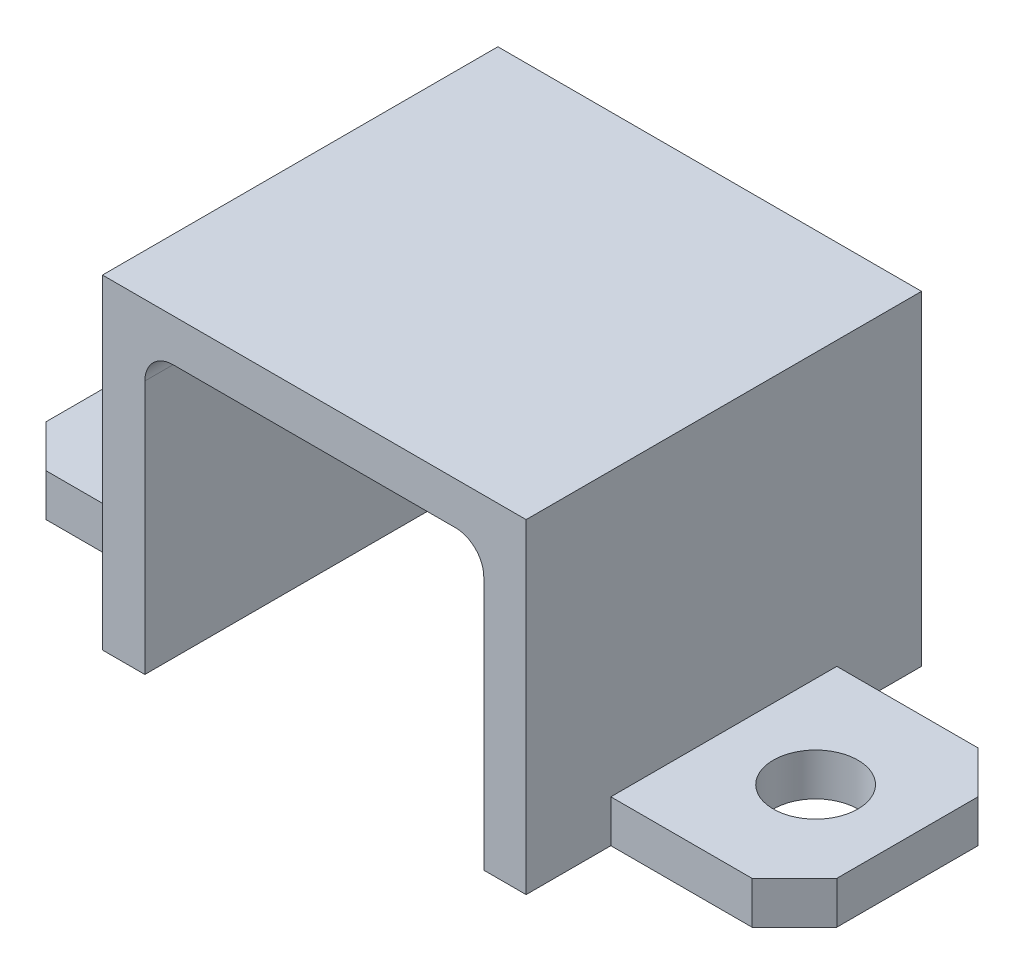
ISO-10303-21;
HEADER;
FILE_DESCRIPTION(('STEP AP214'),'2;1');
FILE_NAME('part.step','',(''),(''),'','','');
FILE_SCHEMA(('AUTOMOTIVE_DESIGN { 1 0 10303 214 1 1 1 1 }'));
ENDSEC;
DATA;
#1=APPLICATION_CONTEXT('core data for automotive mechanical design processes');
#2=APPLICATION_PROTOCOL_DEFINITION('international standard','automotive_design',2000,#1);
#3=PRODUCT_CONTEXT('',#1,'mechanical');
#4=PRODUCT('Part','Part','',(#3));
#5=PRODUCT_RELATED_PRODUCT_CATEGORY('part','',(#4));
#6=PRODUCT_DEFINITION_FORMATION('','',#4);
#7=PRODUCT_DEFINITION_CONTEXT('part definition',#1,'design');
#8=PRODUCT_DEFINITION('design','',#6,#7);
#9=PRODUCT_DEFINITION_SHAPE('','',#8);
#10=(LENGTH_UNIT() NAMED_UNIT(*) SI_UNIT(.MILLI.,.METRE.));
#11=(NAMED_UNIT(*) PLANE_ANGLE_UNIT() SI_UNIT($,.RADIAN.));
#12=(NAMED_UNIT(*) SI_UNIT($,.STERADIAN.) SOLID_ANGLE_UNIT());
#13=UNCERTAINTY_MEASURE_WITH_UNIT(LENGTH_MEASURE(1.E-05),#10,'distance_accuracy_value','');
#14=(GEOMETRIC_REPRESENTATION_CONTEXT(3) GLOBAL_UNCERTAINTY_ASSIGNED_CONTEXT((#13)) GLOBAL_UNIT_ASSIGNED_CONTEXT((#10,
#11,#12)) REPRESENTATION_CONTEXT('',''));
#15=CARTESIAN_POINT('',(0.,0.,0.));
#16=DIRECTION('',(0.,0.,1.));
#17=DIRECTION('',(1.,0.,0.));
#18=AXIS2_PLACEMENT_3D('',#15,#16,#17);
#19=CARTESIAN_POINT('',(13.,9.,0.));
#20=DIRECTION('',(0.,0.,-1.));
#21=DIRECTION('',(-1.,0.,0.));
#22=AXIS2_PLACEMENT_3D('',#19,#20,#21);
#23=PLANE('',#22);
#24=DIRECTION('',(0.,1.,0.));
#25=VECTOR('',#24,1.);
#26=CARTESIAN_POINT('',(0.5,1.5,0.));
#27=LINE('',#26,#25);
#28=CARTESIAN_POINT('',(0.5,0.,0.));
#29=VERTEX_POINT('',#28);
#30=CARTESIAN_POINT('',(0.5,1.5,0.));
#31=VERTEX_POINT('',#30);
#32=EDGE_CURVE('E57',#29,#31,#27,.T.);
#33=ORIENTED_EDGE('',*,*,#32,.F.);
#34=DIRECTION('',(1.,0.,0.));
#35=VECTOR('',#34,1.);
#36=CARTESIAN_POINT('',(2.,0.,0.));
#37=LINE('',#36,#35);
#38=CARTESIAN_POINT('',(-4.5,0.,0.));
#39=VERTEX_POINT('',#38);
#40=EDGE_CURVE('E322',#39,#29,#37,.T.);
#41=ORIENTED_EDGE('',*,*,#40,.F.);
#42=DIRECTION('',(0.,1.,0.));
#43=VECTOR('',#42,1.);
#44=CARTESIAN_POINT('',(-4.5,0.,0.));
#45=LINE('',#44,#43);
#46=CARTESIAN_POINT('',(-4.5,1.5,0.));
#47=VERTEX_POINT('',#46);
#48=EDGE_CURVE('E265',#39,#47,#45,.T.);
#49=ORIENTED_EDGE('',*,*,#48,.T.);
#50=DIRECTION('',(-1.,0.,0.));
#51=VECTOR('',#50,1.);
#52=CARTESIAN_POINT('',(-6.,1.5,0.));
#53=LINE('',#52,#51);
#54=EDGE_CURVE('E345',#31,#47,#53,.T.);
#55=ORIENTED_EDGE('',*,*,#54,.F.);
#56=EDGE_LOOP('',(#33,#41,#49,#55));
#57=FACE_BOUND('',#56,.T.);
#58=ADVANCED_FACE('F41',(#57),#23,.T.);
#59=CARTESIAN_POINT('',(22.,0.,11.));
#60=DIRECTION('',(-1.,0.,0.));
#61=DIRECTION('',(0.,0.,1.));
#62=AXIS2_PLACEMENT_3D('',#59,#60,#61);
#63=PLANE('',#62);
#64=DIRECTION('',(0.,0.,-1.));
#65=VECTOR('',#64,1.);
#66=CARTESIAN_POINT('',(22.,0.,11.));
#67=LINE('',#66,#65);
#68=CARTESIAN_POINT('',(22.,0.,6.5));
#69=VERTEX_POINT('',#68);
#70=CARTESIAN_POINT('',(22.,0.,1.5));
#71=VERTEX_POINT('',#70);
#72=EDGE_CURVE('E370',#69,#71,#67,.T.);
#73=ORIENTED_EDGE('',*,*,#72,.T.);
#74=DIRECTION('',(0.,1.,0.));
#75=VECTOR('',#74,1.);
#76=CARTESIAN_POINT('',(22.,0.,1.5));
#77=LINE('',#76,#75);
#78=CARTESIAN_POINT('',(22.,1.5,1.5));
#79=VERTEX_POINT('',#78);
#80=EDGE_CURVE('E278',#71,#79,#77,.T.);
#81=ORIENTED_EDGE('',*,*,#80,.T.);
#82=DIRECTION('',(0.,0.,-1.));
#83=VECTOR('',#82,1.);
#84=CARTESIAN_POINT('',(22.,1.5,11.));
#85=LINE('',#84,#83);
#86=CARTESIAN_POINT('',(22.,1.5,6.5));
#87=VERTEX_POINT('',#86);
#88=EDGE_CURVE('E367',#87,#79,#85,.T.);
#89=ORIENTED_EDGE('',*,*,#88,.F.);
#90=DIRECTION('',(0.,1.,0.));
#91=VECTOR('',#90,1.);
#92=CARTESIAN_POINT('',(22.,0.,6.5));
#93=LINE('',#92,#91);
#94=EDGE_CURVE('E288',#69,#87,#93,.T.);
#95=ORIENTED_EDGE('',*,*,#94,.F.);
#96=EDGE_LOOP('',(#73,#81,#89,#95));
#97=FACE_BOUND('',#96,.T.);
#98=ADVANCED_FACE('F438',(#97),#63,.F.);
#99=CARTESIAN_POINT('',(22.,1.5,11.));
#100=DIRECTION('',(0.,-1.,0.));
#101=DIRECTION('',(1.,0.,0.));
#102=AXIS2_PLACEMENT_3D('',#99,#100,#101);
#103=PLANE('',#102);
#104=CARTESIAN_POINT('',(18.75,1.5,4.));
#105=DIRECTION('',(0.,1.,0.));
#106=DIRECTION('',(1.,0.,0.));
#107=AXIS2_PLACEMENT_3D('',#104,#105,#106);
#108=CIRCLE('',#107,1.5);
#109=CARTESIAN_POINT('',(20.25,1.5,4.));
#110=VERTEX_POINT('',#109);
#111=EDGE_CURVE('E262',#110,#110,#108,.T.);
#112=ORIENTED_EDGE('',*,*,#111,.F.);
#113=EDGE_LOOP('',(#112));
#114=FACE_BOUND('',#113,.T.);
#115=ORIENTED_EDGE('',*,*,#88,.T.);
#116=DIRECTION('',(0.707106781186547,0.,0.707106781186548));
#117=VECTOR('',#116,1.);
#118=CARTESIAN_POINT('',(22.,1.5,1.5));
#119=LINE('',#118,#117);
#120=CARTESIAN_POINT('',(20.5,1.5,0.));
#121=VERTEX_POINT('',#120);
#122=EDGE_CURVE('E279',#121,#79,#119,.T.);
#123=ORIENTED_EDGE('',*,*,#122,.F.);
#124=DIRECTION('',(-1.,0.,0.));
#125=VECTOR('',#124,1.);
#126=CARTESIAN_POINT('',(22.,1.5,0.));
#127=LINE('',#126,#125);
#128=CARTESIAN_POINT('',(15.5,1.5,0.));
#129=VERTEX_POINT('',#128);
#130=EDGE_CURVE('E342',#121,#129,#127,.T.);
#131=ORIENTED_EDGE('',*,*,#130,.T.);
#132=DIRECTION('',(0.,0.,-1.));
#133=VECTOR('',#132,1.);
#134=CARTESIAN_POINT('',(15.5,1.5,11.));
#135=LINE('',#134,#133);
#136=CARTESIAN_POINT('',(15.5,1.5,8.));
#137=VERTEX_POINT('',#136);
#138=EDGE_CURVE('E364',#137,#129,#135,.T.);
#139=ORIENTED_EDGE('',*,*,#138,.F.);
#140=DIRECTION('',(-1.,0.,0.));
#141=VECTOR('',#140,1.);
#142=CARTESIAN_POINT('',(15.5,1.5,8.));
#143=LINE('',#142,#141);
#144=CARTESIAN_POINT('',(20.5,1.5,8.));
#145=VERTEX_POINT('',#144);
#146=EDGE_CURVE('E314',#145,#137,#143,.T.);
#147=ORIENTED_EDGE('',*,*,#146,.F.);
#148=DIRECTION('',(-0.707106781186547,0.,0.707106781186548));
#149=VECTOR('',#148,1.);
#150=CARTESIAN_POINT('',(22.,1.5,6.5));
#151=LINE('',#150,#149);
#152=EDGE_CURVE('E255',#87,#145,#151,.T.);
#153=ORIENTED_EDGE('',*,*,#152,.F.);
#154=EDGE_LOOP('',(#115,#123,#131,#139,#147,#153));
#155=FACE_BOUND('',#154,.T.);
#156=ADVANCED_FACE('F446',(#114,#155),#103,.F.);
#157=CARTESIAN_POINT('',(13.,9.,11.));
#158=DIRECTION('',(0.,0.,-1.));
#159=DIRECTION('',(-1.,0.,0.));
#160=AXIS2_PLACEMENT_3D('',#157,#158,#159);
#161=CYLINDRICAL_SURFACE('',#160,1.);
#162=DIRECTION('',(0.,0.,-1.));
#163=VECTOR('',#162,1.);
#164=CARTESIAN_POINT('',(13.,10.,11.));
#165=LINE('',#164,#163);
#166=CARTESIAN_POINT('',(13.,10.,11.));
#167=VERTEX_POINT('',#166);
#168=CARTESIAN_POINT('',(13.,10.,-3.));
#169=VERTEX_POINT('',#168);
#170=EDGE_CURVE('E340',#167,#169,#165,.T.);
#171=ORIENTED_EDGE('',*,*,#170,.T.);
#172=CARTESIAN_POINT('',(13.,9.,-3.));
#173=DIRECTION('',(0.,0.,1.));
#174=DIRECTION('',(-1.,0.,0.));
#175=AXIS2_PLACEMENT_3D('',#172,#173,#174);
#176=CIRCLE('',#175,1.);
#177=CARTESIAN_POINT('',(14.,9.,-3.));
#178=VERTEX_POINT('',#177);
#179=EDGE_CURVE('E231',#178,#169,#176,.T.);
#180=ORIENTED_EDGE('',*,*,#179,.F.);
#181=DIRECTION('',(0.,0.,-1.));
#182=VECTOR('',#181,1.);
#183=CARTESIAN_POINT('',(14.,9.,11.));
#184=LINE('',#183,#182);
#185=CARTESIAN_POINT('',(14.,9.,11.));
#186=VERTEX_POINT('',#185);
#187=EDGE_CURVE('E45',#186,#178,#184,.T.);
#188=ORIENTED_EDGE('',*,*,#187,.F.);
#189=CARTESIAN_POINT('',(13.,9.,11.));
#190=DIRECTION('',(0.,0.,-1.));
#191=DIRECTION('',(-1.,0.,0.));
#192=AXIS2_PLACEMENT_3D('',#189,#190,#191);
#193=CIRCLE('',#192,1.);
#194=EDGE_CURVE('E318',#167,#186,#193,.T.);
#195=ORIENTED_EDGE('',*,*,#194,.F.);
#196=EDGE_LOOP('',(#171,#180,#188,#195));
#197=FACE_BOUND('',#196,.T.);
#198=ADVANCED_FACE('F43',(#197),#161,.F.);
#199=CARTESIAN_POINT('',(14.,9.,11.));
#200=DIRECTION('',(1.,0.,0.));
#201=DIRECTION('',(0.,0.,-1.));
#202=AXIS2_PLACEMENT_3D('',#199,#200,#201);
#203=PLANE('',#202);
#204=ORIENTED_EDGE('',*,*,#187,.T.);
#205=DIRECTION('',(0.,1.,0.));
#206=VECTOR('',#205,1.);
#207=CARTESIAN_POINT('',(14.,0.,-3.));
#208=LINE('',#207,#206);
#209=CARTESIAN_POINT('',(14.,0.,-3.));
#210=VERTEX_POINT('',#209);
#211=EDGE_CURVE('E228',#210,#178,#208,.T.);
#212=ORIENTED_EDGE('',*,*,#211,.F.);
#213=DIRECTION('',(0.,0.,-1.));
#214=VECTOR('',#213,1.);
#215=CARTESIAN_POINT('',(14.,0.,11.));
#216=LINE('',#215,#214);
#217=CARTESIAN_POINT('',(14.,0.,11.));
#218=VERTEX_POINT('',#217);
#219=EDGE_CURVE('E372',#218,#210,#216,.T.);
#220=ORIENTED_EDGE('',*,*,#219,.F.);
#221=DIRECTION('',(0.,-1.,0.));
#222=VECTOR('',#221,1.);
#223=CARTESIAN_POINT('',(14.,9.,11.));
#224=LINE('',#223,#222);
#225=EDGE_CURVE('E321',#186,#218,#224,.T.);
#226=ORIENTED_EDGE('',*,*,#225,.F.);
#227=EDGE_LOOP('',(#204,#212,#220,#226));
#228=FACE_BOUND('',#227,.T.);
#229=ADVANCED_FACE('F379',(#228),#203,.F.);
#230=CARTESIAN_POINT('',(14.,0.,11.));
#231=DIRECTION('',(0.,1.,0.));
#232=DIRECTION('',(-1.,0.,0.));
#233=AXIS2_PLACEMENT_3D('',#230,#231,#232);
#234=PLANE('',#233);
#235=CARTESIAN_POINT('',(18.75,0.,4.));
#236=DIRECTION('',(0.,1.,0.));
#237=DIRECTION('',(1.,0.,0.));
#238=AXIS2_PLACEMENT_3D('',#235,#236,#237);
#239=CIRCLE('',#238,1.5);
#240=CARTESIAN_POINT('',(20.25,0.,4.));
#241=VERTEX_POINT('',#240);
#242=EDGE_CURVE('E258',#241,#241,#239,.T.);
#243=ORIENTED_EDGE('',*,*,#242,.T.);
#244=EDGE_LOOP('',(#243));
#245=FACE_BOUND('',#244,.T.);
#246=ORIENTED_EDGE('',*,*,#219,.T.);
#247=DIRECTION('',(-1.,0.,0.));
#248=VECTOR('',#247,1.);
#249=CARTESIAN_POINT('',(15.5,0.,-3.));
#250=LINE('',#249,#248);
#251=CARTESIAN_POINT('',(15.5,0.,-3.));
#252=VERTEX_POINT('',#251);
#253=EDGE_CURVE('E225',#252,#210,#250,.T.);
#254=ORIENTED_EDGE('',*,*,#253,.F.);
#255=DIRECTION('',(0.,0.,1.));
#256=VECTOR('',#255,1.);
#257=CARTESIAN_POINT('',(15.5,0.,-3.));
#258=LINE('',#257,#256);
#259=CARTESIAN_POINT('',(15.5,0.,0.));
#260=VERTEX_POINT('',#259);
#261=EDGE_CURVE('E245',#252,#260,#258,.T.);
#262=ORIENTED_EDGE('',*,*,#261,.T.);
#263=DIRECTION('',(1.,0.,0.));
#264=VECTOR('',#263,1.);
#265=CARTESIAN_POINT('',(14.,0.,0.));
#266=LINE('',#265,#264);
#267=CARTESIAN_POINT('',(20.5,0.,0.));
#268=VERTEX_POINT('',#267);
#269=EDGE_CURVE('E65',#260,#268,#266,.T.);
#270=ORIENTED_EDGE('',*,*,#269,.T.);
#271=DIRECTION('',(0.707106781186547,0.,0.707106781186548));
#272=VECTOR('',#271,1.);
#273=CARTESIAN_POINT('',(22.,0.,1.5));
#274=LINE('',#273,#272);
#275=EDGE_CURVE('E276',#268,#71,#274,.T.);
#276=ORIENTED_EDGE('',*,*,#275,.T.);
#277=ORIENTED_EDGE('',*,*,#72,.F.);
#278=DIRECTION('',(-0.707106781186547,0.,0.707106781186548));
#279=VECTOR('',#278,1.);
#280=CARTESIAN_POINT('',(22.,0.,6.5));
#281=LINE('',#280,#279);
#282=CARTESIAN_POINT('',(20.5,0.,8.));
#283=VERTEX_POINT('',#282);
#284=EDGE_CURVE('E285',#69,#283,#281,.T.);
#285=ORIENTED_EDGE('',*,*,#284,.T.);
#286=DIRECTION('',(1.,0.,0.));
#287=VECTOR('',#286,1.);
#288=CARTESIAN_POINT('',(15.5,0.,8.));
#289=LINE('',#288,#287);
#290=CARTESIAN_POINT('',(15.5,0.,8.));
#291=VERTEX_POINT('',#290);
#292=EDGE_CURVE('E311',#291,#283,#289,.T.);
#293=ORIENTED_EDGE('',*,*,#292,.F.);
#294=DIRECTION('',(0.,0.,1.));
#295=VECTOR('',#294,1.);
#296=CARTESIAN_POINT('',(15.5,0.,8.));
#297=LINE('',#296,#295);
#298=CARTESIAN_POINT('',(15.5,0.,11.));
#299=VERTEX_POINT('',#298);
#300=EDGE_CURVE('E302',#291,#299,#297,.T.);
#301=ORIENTED_EDGE('',*,*,#300,.T.);
#302=DIRECTION('',(1.,0.,0.));
#303=VECTOR('',#302,1.);
#304=CARTESIAN_POINT('',(14.,0.,11.));
#305=LINE('',#304,#303);
#306=EDGE_CURVE('E324',#218,#299,#305,.T.);
#307=ORIENTED_EDGE('',*,*,#306,.F.);
#308=EDGE_LOOP('',(#246,#254,#262,#270,#276,#277,#285,#293,#301,#307));
#309=FACE_BOUND('',#308,.T.);
#310=ADVANCED_FACE('F427',(#245,#309),#234,.F.);
#311=CARTESIAN_POINT('',(15.5,11.5,11.));
#312=DIRECTION('',(-1.,0.,0.));
#313=DIRECTION('',(0.,-1.,0.));
#314=AXIS2_PLACEMENT_3D('',#311,#312,#313);
#315=PLANE('',#314);
#316=ORIENTED_EDGE('',*,*,#138,.T.);
#317=DIRECTION('',(0.,-1.,0.));
#318=VECTOR('',#317,1.);
#319=CARTESIAN_POINT('',(15.5,1.5,0.));
#320=LINE('',#319,#318);
#321=EDGE_CURVE('E11',#129,#260,#320,.T.);
#322=ORIENTED_EDGE('',*,*,#321,.T.);
#323=ORIENTED_EDGE('',*,*,#261,.F.);
#324=DIRECTION('',(0.,-1.,0.));
#325=VECTOR('',#324,1.);
#326=CARTESIAN_POINT('',(15.5,11.5,-3.));
#327=LINE('',#326,#325);
#328=CARTESIAN_POINT('',(15.5,11.5,-3.));
#329=VERTEX_POINT('',#328);
#330=EDGE_CURVE('E214',#329,#252,#327,.T.);
#331=ORIENTED_EDGE('',*,*,#330,.F.);
#332=DIRECTION('',(0.,0.,-1.));
#333=VECTOR('',#332,1.);
#334=CARTESIAN_POINT('',(15.5,11.5,11.));
#335=LINE('',#334,#333);
#336=CARTESIAN_POINT('',(15.5,11.5,11.));
#337=VERTEX_POINT('',#336);
#338=EDGE_CURVE('E205',#337,#329,#335,.T.);
#339=ORIENTED_EDGE('',*,*,#338,.F.);
#340=DIRECTION('',(0.,1.,0.));
#341=VECTOR('',#340,1.);
#342=CARTESIAN_POINT('',(15.5,11.5,11.));
#343=LINE('',#342,#341);
#344=EDGE_CURVE('E327',#299,#337,#343,.T.);
#345=ORIENTED_EDGE('',*,*,#344,.F.);
#346=ORIENTED_EDGE('',*,*,#300,.F.);
#347=DIRECTION('',(0.,-1.,0.));
#348=VECTOR('',#347,1.);
#349=CARTESIAN_POINT('',(15.5,1.5,8.));
#350=LINE('',#349,#348);
#351=EDGE_CURVE('E296',#137,#291,#350,.T.);
#352=ORIENTED_EDGE('',*,*,#351,.F.);
#353=EDGE_LOOP('',(#316,#322,#323,#331,#339,#345,#346,#352));
#354=FACE_BOUND('',#353,.T.);
#355=ADVANCED_FACE('F425',(#354),#315,.F.);
#356=CARTESIAN_POINT('',(0.5,11.5,11.));
#357=DIRECTION('',(0.,-1.,0.));
#358=DIRECTION('',(0.,0.,-1.));
#359=AXIS2_PLACEMENT_3D('',#356,#357,#358);
#360=PLANE('',#359);
#361=ORIENTED_EDGE('',*,*,#338,.T.);
#362=DIRECTION('',(1.,0.,0.));
#363=VECTOR('',#362,1.);
#364=CARTESIAN_POINT('',(0.5,11.5,-3.));
#365=LINE('',#364,#363);
#366=CARTESIAN_POINT('',(0.5,11.5,-3.));
#367=VERTEX_POINT('',#366);
#368=EDGE_CURVE('E209',#367,#329,#365,.T.);
#369=ORIENTED_EDGE('',*,*,#368,.F.);
#370=DIRECTION('',(0.,0.,-1.));
#371=VECTOR('',#370,1.);
#372=CARTESIAN_POINT('',(0.5,11.5,11.));
#373=LINE('',#372,#371);
#374=CARTESIAN_POINT('',(0.5,11.5,11.));
#375=VERTEX_POINT('',#374);
#376=EDGE_CURVE('E194',#375,#367,#373,.T.);
#377=ORIENTED_EDGE('',*,*,#376,.F.);
#378=DIRECTION('',(-1.,0.,0.));
#379=VECTOR('',#378,1.);
#380=CARTESIAN_POINT('',(0.5,11.5,11.));
#381=LINE('',#380,#379);
#382=EDGE_CURVE('E329',#337,#375,#381,.T.);
#383=ORIENTED_EDGE('',*,*,#382,.F.);
#384=EDGE_LOOP('',(#361,#369,#377,#383));
#385=FACE_BOUND('',#384,.T.);
#386=ADVANCED_FACE('F210',(#385),#360,.F.);
#387=CARTESIAN_POINT('',(0.5,1.5,11.));
#388=DIRECTION('',(1.,0.,0.));
#389=DIRECTION('',(0.,0.,-1.));
#390=AXIS2_PLACEMENT_3D('',#387,#388,#389);
#391=PLANE('',#390);
#392=ORIENTED_EDGE('',*,*,#376,.T.);
#393=DIRECTION('',(0.,1.,0.));
#394=VECTOR('',#393,1.);
#395=CARTESIAN_POINT('',(0.5,1.5,-3.));
#396=LINE('',#395,#394);
#397=CARTESIAN_POINT('',(0.5,0.,-3.));
#398=VERTEX_POINT('',#397);
#399=EDGE_CURVE('E199',#398,#367,#396,.T.);
#400=ORIENTED_EDGE('',*,*,#399,.F.);
#401=DIRECTION('',(0.,0.,1.));
#402=VECTOR('',#401,1.);
#403=CARTESIAN_POINT('',(0.5,0.,-3.));
#404=LINE('',#403,#402);
#405=EDGE_CURVE('E242',#398,#29,#404,.T.);
#406=ORIENTED_EDGE('',*,*,#405,.T.);
#407=ORIENTED_EDGE('',*,*,#32,.T.);
#408=DIRECTION('',(0.,0.,-1.));
#409=VECTOR('',#408,1.);
#410=CARTESIAN_POINT('',(0.5,1.5,11.));
#411=LINE('',#410,#409);
#412=CARTESIAN_POINT('',(0.5,1.5,8.));
#413=VERTEX_POINT('',#412);
#414=EDGE_CURVE('E206',#413,#31,#411,.T.);
#415=ORIENTED_EDGE('',*,*,#414,.F.);
#416=DIRECTION('',(0.,1.,0.));
#417=VECTOR('',#416,1.);
#418=CARTESIAN_POINT('',(0.5,1.5,8.));
#419=LINE('',#418,#417);
#420=CARTESIAN_POINT('',(0.5,0.,8.));
#421=VERTEX_POINT('',#420);
#422=EDGE_CURVE('E299',#421,#413,#419,.T.);
#423=ORIENTED_EDGE('',*,*,#422,.F.);
#424=DIRECTION('',(0.,0.,1.));
#425=VECTOR('',#424,1.);
#426=CARTESIAN_POINT('',(0.5,0.,8.));
#427=LINE('',#426,#425);
#428=CARTESIAN_POINT('',(0.5,0.,11.));
#429=VERTEX_POINT('',#428);
#430=EDGE_CURVE('E307',#421,#429,#427,.T.);
#431=ORIENTED_EDGE('',*,*,#430,.T.);
#432=DIRECTION('',(0.,-1.,0.));
#433=VECTOR('',#432,1.);
#434=CARTESIAN_POINT('',(0.5,1.5,11.));
#435=LINE('',#434,#433);
#436=EDGE_CURVE('E202',#375,#429,#435,.T.);
#437=ORIENTED_EDGE('',*,*,#436,.F.);
#438=EDGE_LOOP('',(#392,#400,#406,#407,#415,#423,#431,#437));
#439=FACE_BOUND('',#438,.T.);
#440=ADVANCED_FACE('F196',(#439),#391,.F.);
#441=CARTESIAN_POINT('',(-6.,1.5,11.));
#442=DIRECTION('',(0.,-1.,0.));
#443=DIRECTION('',(1.,0.,0.));
#444=AXIS2_PLACEMENT_3D('',#441,#442,#443);
#445=PLANE('',#444);
#446=CARTESIAN_POINT('',(-2.75,1.5,4.));
#447=DIRECTION('',(0.,1.,0.));
#448=DIRECTION('',(-1.,0.,0.));
#449=AXIS2_PLACEMENT_3D('',#446,#447,#448);
#450=CIRCLE('',#449,1.5);
#451=CARTESIAN_POINT('',(-4.25,1.5,4.));
#452=VERTEX_POINT('',#451);
#453=EDGE_CURVE('E261',#452,#452,#450,.T.);
#454=ORIENTED_EDGE('',*,*,#453,.F.);
#455=EDGE_LOOP('',(#454));
#456=FACE_BOUND('',#455,.T.);
#457=ORIENTED_EDGE('',*,*,#54,.T.);
#458=DIRECTION('',(0.707106781186547,0.,-0.707106781186548));
#459=VECTOR('',#458,1.);
#460=CARTESIAN_POINT('',(-6.,1.5,1.5));
#461=LINE('',#460,#459);
#462=CARTESIAN_POINT('',(-6.,1.5,1.5));
#463=VERTEX_POINT('',#462);
#464=EDGE_CURVE('E270',#463,#47,#461,.T.);
#465=ORIENTED_EDGE('',*,*,#464,.F.);
#466=DIRECTION('',(0.,0.,-1.));
#467=VECTOR('',#466,1.);
#468=CARTESIAN_POINT('',(-6.,1.5,11.));
#469=LINE('',#468,#467);
#470=CARTESIAN_POINT('',(-6.,1.5,6.5));
#471=VERTEX_POINT('',#470);
#472=EDGE_CURVE('E359',#471,#463,#469,.T.);
#473=ORIENTED_EDGE('',*,*,#472,.F.);
#474=DIRECTION('',(-0.707106781186548,0.,-0.707106781186548));
#475=VECTOR('',#474,1.);
#476=CARTESIAN_POINT('',(-6.,1.5,6.5));
#477=LINE('',#476,#475);
#478=CARTESIAN_POINT('',(-4.5,1.5,8.));
#479=VERTEX_POINT('',#478);
#480=EDGE_CURVE('E247',#479,#471,#477,.T.);
#481=ORIENTED_EDGE('',*,*,#480,.F.);
#482=DIRECTION('',(-1.,0.,0.));
#483=VECTOR('',#482,1.);
#484=CARTESIAN_POINT('',(0.5,1.5,8.));
#485=LINE('',#484,#483);
#486=EDGE_CURVE('E301',#413,#479,#485,.T.);
#487=ORIENTED_EDGE('',*,*,#486,.F.);
#488=ORIENTED_EDGE('',*,*,#414,.T.);
#489=EDGE_LOOP('',(#457,#465,#473,#481,#487,#488));
#490=FACE_BOUND('',#489,.T.);
#491=ADVANCED_FACE('F407',(#456,#490),#445,.F.);
#492=CARTESIAN_POINT('',(-6.,0.,11.));
#493=DIRECTION('',(1.,0.,0.));
#494=DIRECTION('',(0.,0.,-1.));
#495=AXIS2_PLACEMENT_3D('',#492,#493,#494);
#496=PLANE('',#495);
#497=ORIENTED_EDGE('',*,*,#472,.T.);
#498=DIRECTION('',(0.,1.,0.));
#499=VECTOR('',#498,1.);
#500=CARTESIAN_POINT('',(-6.,0.,1.5));
#501=LINE('',#500,#499);
#502=CARTESIAN_POINT('',(-6.,0.,1.5));
#503=VERTEX_POINT('',#502);
#504=EDGE_CURVE('E269',#503,#463,#501,.T.);
#505=ORIENTED_EDGE('',*,*,#504,.F.);
#506=DIRECTION('',(0.,0.,-1.));
#507=VECTOR('',#506,1.);
#508=CARTESIAN_POINT('',(-6.,0.,11.));
#509=LINE('',#508,#507);
#510=CARTESIAN_POINT('',(-6.,0.,6.5));
#511=VERTEX_POINT('',#510);
#512=EDGE_CURVE('E356',#511,#503,#509,.T.);
#513=ORIENTED_EDGE('',*,*,#512,.F.);
#514=DIRECTION('',(0.,1.,0.));
#515=VECTOR('',#514,1.);
#516=CARTESIAN_POINT('',(-6.,0.,6.5));
#517=LINE('',#516,#515);
#518=EDGE_CURVE('E251',#511,#471,#517,.T.);
#519=ORIENTED_EDGE('',*,*,#518,.T.);
#520=EDGE_LOOP('',(#497,#505,#513,#519));
#521=FACE_BOUND('',#520,.T.);
#522=ADVANCED_FACE('F416',(#521),#496,.F.);
#523=CARTESIAN_POINT('',(2.,0.,11.));
#524=DIRECTION('',(0.,1.,0.));
#525=DIRECTION('',(-1.,0.,0.));
#526=AXIS2_PLACEMENT_3D('',#523,#524,#525);
#527=PLANE('',#526);
#528=CARTESIAN_POINT('',(-2.75,0.,4.));
#529=DIRECTION('',(0.,1.,0.));
#530=DIRECTION('',(-1.,0.,0.));
#531=AXIS2_PLACEMENT_3D('',#528,#529,#530);
#532=CIRCLE('',#531,1.5);
#533=CARTESIAN_POINT('',(-4.25,0.,4.));
#534=VERTEX_POINT('',#533);
#535=EDGE_CURVE('E293',#534,#534,#532,.T.);
#536=ORIENTED_EDGE('',*,*,#535,.T.);
#537=EDGE_LOOP('',(#536));
#538=FACE_BOUND('',#537,.T.);
#539=ORIENTED_EDGE('',*,*,#512,.T.);
#540=DIRECTION('',(0.707106781186547,0.,-0.707106781186548));
#541=VECTOR('',#540,1.);
#542=CARTESIAN_POINT('',(-6.,0.,1.5));
#543=LINE('',#542,#541);
#544=EDGE_CURVE('E266',#503,#39,#543,.T.);
#545=ORIENTED_EDGE('',*,*,#544,.T.);
#546=ORIENTED_EDGE('',*,*,#40,.T.);
#547=ORIENTED_EDGE('',*,*,#405,.F.);
#548=DIRECTION('',(-1.,0.,0.));
#549=VECTOR('',#548,1.);
#550=CARTESIAN_POINT('',(2.,0.,-3.));
#551=LINE('',#550,#549);
#552=CARTESIAN_POINT('',(2.,0.,-3.));
#553=VERTEX_POINT('',#552);
#554=EDGE_CURVE('E219',#553,#398,#551,.T.);
#555=ORIENTED_EDGE('',*,*,#554,.F.);
#556=DIRECTION('',(0.,0.,-1.));
#557=VECTOR('',#556,1.);
#558=CARTESIAN_POINT('',(2.,0.,11.));
#559=LINE('',#558,#557);
#560=CARTESIAN_POINT('',(2.,0.,11.));
#561=VERTEX_POINT('',#560);
#562=EDGE_CURVE('E354',#561,#553,#559,.T.);
#563=ORIENTED_EDGE('',*,*,#562,.F.);
#564=DIRECTION('',(1.,0.,0.));
#565=VECTOR('',#564,1.);
#566=CARTESIAN_POINT('',(2.,0.,11.));
#567=LINE('',#566,#565);
#568=EDGE_CURVE('E332',#429,#561,#567,.T.);
#569=ORIENTED_EDGE('',*,*,#568,.F.);
#570=ORIENTED_EDGE('',*,*,#430,.F.);
#571=DIRECTION('',(1.,0.,0.));
#572=VECTOR('',#571,1.);
#573=CARTESIAN_POINT('',(0.5,0.,8.));
#574=LINE('',#573,#572);
#575=CARTESIAN_POINT('',(-4.5,0.,8.));
#576=VERTEX_POINT('',#575);
#577=EDGE_CURVE('E305',#576,#421,#574,.T.);
#578=ORIENTED_EDGE('',*,*,#577,.F.);
#579=DIRECTION('',(-0.707106781186548,0.,-0.707106781186548));
#580=VECTOR('',#579,1.);
#581=CARTESIAN_POINT('',(-6.,0.,6.5));
#582=LINE('',#581,#580);
#583=EDGE_CURVE('E248',#576,#511,#582,.T.);
#584=ORIENTED_EDGE('',*,*,#583,.T.);
#585=EDGE_LOOP('',(#539,#545,#546,#547,#555,#563,#569,#570,#578,#584));
#586=FACE_BOUND('',#585,.T.);
#587=ADVANCED_FACE('F400',(#538,#586),#527,.F.);
#588=CARTESIAN_POINT('',(2.,0.,11.));
#589=DIRECTION('',(-1.,0.,0.));
#590=DIRECTION('',(0.,0.,1.));
#591=AXIS2_PLACEMENT_3D('',#588,#589,#590);
#592=PLANE('',#591);
#593=ORIENTED_EDGE('',*,*,#562,.T.);
#594=DIRECTION('',(0.,-1.,0.));
#595=VECTOR('',#594,1.);
#596=CARTESIAN_POINT('',(2.,9.,-3.));
#597=LINE('',#596,#595);
#598=CARTESIAN_POINT('',(2.,9.,-3.));
#599=VERTEX_POINT('',#598);
#600=EDGE_CURVE('E240',#599,#553,#597,.T.);
#601=ORIENTED_EDGE('',*,*,#600,.F.);
#602=DIRECTION('',(0.,0.,-1.));
#603=VECTOR('',#602,1.);
#604=CARTESIAN_POINT('',(2.,9.,11.));
#605=LINE('',#604,#603);
#606=CARTESIAN_POINT('',(2.,9.,11.));
#607=VERTEX_POINT('',#606);
#608=EDGE_CURVE('E352',#607,#599,#605,.T.);
#609=ORIENTED_EDGE('',*,*,#608,.F.);
#610=DIRECTION('',(0.,1.,0.));
#611=VECTOR('',#610,1.);
#612=CARTESIAN_POINT('',(2.,0.,11.));
#613=LINE('',#612,#611);
#614=EDGE_CURVE('E334',#561,#607,#613,.T.);
#615=ORIENTED_EDGE('',*,*,#614,.F.);
#616=EDGE_LOOP('',(#593,#601,#609,#615));
#617=FACE_BOUND('',#616,.T.);
#618=ADVANCED_FACE('F397',(#617),#592,.F.);
#619=CARTESIAN_POINT('',(3.,9.,11.));
#620=DIRECTION('',(0.,0.,-1.));
#621=DIRECTION('',(-1.,0.,0.));
#622=AXIS2_PLACEMENT_3D('',#619,#620,#621);
#623=CYLINDRICAL_SURFACE('',#622,1.);
#624=ORIENTED_EDGE('',*,*,#608,.T.);
#625=CARTESIAN_POINT('',(3.,9.,-3.));
#626=DIRECTION('',(0.,0.,1.));
#627=DIRECTION('',(-1.,0.,0.));
#628=AXIS2_PLACEMENT_3D('',#625,#626,#627);
#629=CIRCLE('',#628,0.999999999999999);
#630=CARTESIAN_POINT('',(3.,10.,-3.));
#631=VERTEX_POINT('',#630);
#632=EDGE_CURVE('E237',#631,#599,#629,.T.);
#633=ORIENTED_EDGE('',*,*,#632,.F.);
#634=DIRECTION('',(0.,0.,-1.));
#635=VECTOR('',#634,1.);
#636=CARTESIAN_POINT('',(3.,10.,11.));
#637=LINE('',#636,#635);
#638=CARTESIAN_POINT('',(3.,10.,11.));
#639=VERTEX_POINT('',#638);
#640=EDGE_CURVE('E350',#639,#631,#637,.T.);
#641=ORIENTED_EDGE('',*,*,#640,.F.);
#642=CARTESIAN_POINT('',(3.,9.,11.));
#643=DIRECTION('',(0.,0.,-1.));
#644=DIRECTION('',(-1.,0.,0.));
#645=AXIS2_PLACEMENT_3D('',#642,#643,#644);
#646=CIRCLE('',#645,1.);
#647=EDGE_CURVE('E336',#607,#639,#646,.T.);
#648=ORIENTED_EDGE('',*,*,#647,.F.);
#649=EDGE_LOOP('',(#624,#633,#641,#648));
#650=FACE_BOUND('',#649,.T.);
#651=ADVANCED_FACE('F392',(#650),#623,.F.);
#652=CARTESIAN_POINT('',(3.,10.,11.));
#653=DIRECTION('',(0.,1.,0.));
#654=DIRECTION('',(0.,0.,1.));
#655=AXIS2_PLACEMENT_3D('',#652,#653,#654);
#656=PLANE('',#655);
#657=ORIENTED_EDGE('',*,*,#640,.T.);
#658=DIRECTION('',(-1.,0.,0.));
#659=VECTOR('',#658,1.);
#660=CARTESIAN_POINT('',(13.,10.,-3.));
#661=LINE('',#660,#659);
#662=EDGE_CURVE('E234',#169,#631,#661,.T.);
#663=ORIENTED_EDGE('',*,*,#662,.F.);
#664=ORIENTED_EDGE('',*,*,#170,.F.);
#665=DIRECTION('',(1.,0.,0.));
#666=VECTOR('',#665,1.);
#667=CARTESIAN_POINT('',(3.,10.,11.));
#668=LINE('',#667,#666);
#669=EDGE_CURVE('E338',#639,#167,#668,.T.);
#670=ORIENTED_EDGE('',*,*,#669,.F.);
#671=EDGE_LOOP('',(#657,#663,#664,#670));
#672=FACE_BOUND('',#671,.T.);
#673=ADVANCED_FACE('F387',(#672),#656,.F.);
#674=CARTESIAN_POINT('',(13.,9.,11.));
#675=DIRECTION('',(0.,0.,-1.));
#676=DIRECTION('',(-1.,0.,0.));
#677=AXIS2_PLACEMENT_3D('',#674,#675,#676);
#678=PLANE('',#677);
#679=ORIENTED_EDGE('',*,*,#436,.T.);
#680=ORIENTED_EDGE('',*,*,#568,.T.);
#681=ORIENTED_EDGE('',*,*,#614,.T.);
#682=ORIENTED_EDGE('',*,*,#647,.T.);
#683=ORIENTED_EDGE('',*,*,#669,.T.);
#684=ORIENTED_EDGE('',*,*,#194,.T.);
#685=ORIENTED_EDGE('',*,*,#225,.T.);
#686=ORIENTED_EDGE('',*,*,#306,.T.);
#687=ORIENTED_EDGE('',*,*,#344,.T.);
#688=ORIENTED_EDGE('',*,*,#382,.T.);
#689=EDGE_LOOP('',(#679,#680,#681,#682,#683,#684,#685,#686,#687,#688));
#690=FACE_BOUND('',#689,.T.);
#691=ADVANCED_FACE('F423',(#690),#678,.F.);
#692=ORIENTED_EDGE('',*,*,#321,.F.);
#693=ORIENTED_EDGE('',*,*,#130,.F.);
#694=DIRECTION('',(0.,1.,0.));
#695=VECTOR('',#694,1.);
#696=CARTESIAN_POINT('',(20.5,0.,0.));
#697=LINE('',#696,#695);
#698=EDGE_CURVE('E272',#268,#121,#697,.T.);
#699=ORIENTED_EDGE('',*,*,#698,.F.);
#700=ORIENTED_EDGE('',*,*,#269,.F.);
#701=EDGE_LOOP('',(#692,#693,#699,#700));
#702=FACE_BOUND('',#701,.T.);
#703=ADVANCED_FACE('F440',(#702),#23,.T.);
#704=CARTESIAN_POINT('',(0.,0.,8.));
#705=DIRECTION('',(0.,0.,1.));
#706=DIRECTION('',(1.,0.,0.));
#707=AXIS2_PLACEMENT_3D('',#704,#705,#706);
#708=PLANE('',#707);
#709=DIRECTION('',(0.,1.,0.));
#710=VECTOR('',#709,1.);
#711=CARTESIAN_POINT('',(20.5,0.,8.));
#712=LINE('',#711,#710);
#713=EDGE_CURVE('E281',#283,#145,#712,.T.);
#714=ORIENTED_EDGE('',*,*,#713,.T.);
#715=ORIENTED_EDGE('',*,*,#146,.T.);
#716=ORIENTED_EDGE('',*,*,#351,.T.);
#717=ORIENTED_EDGE('',*,*,#292,.T.);
#718=EDGE_LOOP('',(#714,#715,#716,#717));
#719=FACE_BOUND('',#718,.T.);
#720=ADVANCED_FACE('F451',(#719),#708,.T.);
#721=CARTESIAN_POINT('',(0.,0.,8.));
#722=DIRECTION('',(0.,0.,-1.));
#723=DIRECTION('',(-1.,0.,0.));
#724=AXIS2_PLACEMENT_3D('',#721,#722,#723);
#725=PLANE('',#724);
#726=ORIENTED_EDGE('',*,*,#486,.T.);
#727=DIRECTION('',(0.,1.,0.));
#728=VECTOR('',#727,1.);
#729=CARTESIAN_POINT('',(-4.5,0.,8.));
#730=LINE('',#729,#728);
#731=EDGE_CURVE('E253',#576,#479,#730,.T.);
#732=ORIENTED_EDGE('',*,*,#731,.F.);
#733=ORIENTED_EDGE('',*,*,#577,.T.);
#734=ORIENTED_EDGE('',*,*,#422,.T.);
#735=EDGE_LOOP('',(#726,#732,#733,#734));
#736=FACE_BOUND('',#735,.T.);
#737=ADVANCED_FACE('F421',(#736),#725,.F.);
#738=CARTESIAN_POINT('',(-6.,0.,6.5));
#739=DIRECTION('',(0.707106781186548,0.,-0.707106781186548));
#740=DIRECTION('',(-0.707106781186548,0.,-0.707106781186548));
#741=AXIS2_PLACEMENT_3D('',#738,#739,#740);
#742=PLANE('',#741);
#743=ORIENTED_EDGE('',*,*,#480,.T.);
#744=ORIENTED_EDGE('',*,*,#518,.F.);
#745=ORIENTED_EDGE('',*,*,#583,.F.);
#746=ORIENTED_EDGE('',*,*,#731,.T.);
#747=EDGE_LOOP('',(#743,#744,#745,#746));
#748=FACE_BOUND('',#747,.T.);
#749=ADVANCED_FACE('F485',(#748),#742,.F.);
#750=CARTESIAN_POINT('',(22.,0.,6.5));
#751=DIRECTION('',(-0.707106781186548,0.,-0.707106781186547));
#752=DIRECTION('',(-0.707106781186547,0.,0.707106781186548));
#753=AXIS2_PLACEMENT_3D('',#750,#751,#752);
#754=PLANE('',#753);
#755=ORIENTED_EDGE('',*,*,#152,.T.);
#756=ORIENTED_EDGE('',*,*,#713,.F.);
#757=ORIENTED_EDGE('',*,*,#284,.F.);
#758=ORIENTED_EDGE('',*,*,#94,.T.);
#759=EDGE_LOOP('',(#755,#756,#757,#758));
#760=FACE_BOUND('',#759,.T.);
#761=ADVANCED_FACE('F472',(#760),#754,.F.);
#762=CARTESIAN_POINT('',(22.,0.,1.5));
#763=DIRECTION('',(-0.707106781186548,0.,0.707106781186547));
#764=DIRECTION('',(0.707106781186547,0.,0.707106781186548));
#765=AXIS2_PLACEMENT_3D('',#762,#763,#764);
#766=PLANE('',#765);
#767=ORIENTED_EDGE('',*,*,#122,.T.);
#768=ORIENTED_EDGE('',*,*,#80,.F.);
#769=ORIENTED_EDGE('',*,*,#275,.F.);
#770=ORIENTED_EDGE('',*,*,#698,.T.);
#771=EDGE_LOOP('',(#767,#768,#769,#770));
#772=FACE_BOUND('',#771,.T.);
#773=ADVANCED_FACE('F476',(#772),#766,.F.);
#774=CARTESIAN_POINT('',(-6.,0.,1.5));
#775=DIRECTION('',(0.707106781186548,0.,0.707106781186547));
#776=DIRECTION('',(0.707106781186547,0.,-0.707106781186548));
#777=AXIS2_PLACEMENT_3D('',#774,#775,#776);
#778=PLANE('',#777);
#779=ORIENTED_EDGE('',*,*,#464,.T.);
#780=ORIENTED_EDGE('',*,*,#48,.F.);
#781=ORIENTED_EDGE('',*,*,#544,.F.);
#782=ORIENTED_EDGE('',*,*,#504,.T.);
#783=EDGE_LOOP('',(#779,#780,#781,#782));
#784=FACE_BOUND('',#783,.T.);
#785=ADVANCED_FACE('F411',(#784),#778,.F.);
#786=CARTESIAN_POINT('',(-2.75,0.,4.));
#787=DIRECTION('',(0.,1.,0.));
#788=DIRECTION('',(-1.,0.,0.));
#789=AXIS2_PLACEMENT_3D('',#786,#787,#788);
#790=CYLINDRICAL_SURFACE('',#789,1.5);
#791=ORIENTED_EDGE('',*,*,#535,.F.);
#792=EDGE_LOOP('',(#791));
#793=FACE_BOUND('',#792,.T.);
#794=ORIENTED_EDGE('',*,*,#453,.T.);
#795=EDGE_LOOP('',(#794));
#796=FACE_BOUND('',#795,.T.);
#797=ADVANCED_FACE('F483',(#793,#796),#790,.F.);
#798=CARTESIAN_POINT('',(18.75,0.,4.));
#799=DIRECTION('',(0.,1.,0.));
#800=DIRECTION('',(-1.,0.,0.));
#801=AXIS2_PLACEMENT_3D('',#798,#799,#800);
#802=CYLINDRICAL_SURFACE('',#801,1.5);
#803=ORIENTED_EDGE('',*,*,#242,.F.);
#804=EDGE_LOOP('',(#803));
#805=FACE_BOUND('',#804,.T.);
#806=ORIENTED_EDGE('',*,*,#111,.T.);
#807=EDGE_LOOP('',(#806));
#808=FACE_BOUND('',#807,.T.);
#809=ADVANCED_FACE('F491',(#805,#808),#802,.F.);
#810=CARTESIAN_POINT('',(13.,9.,-3.));
#811=DIRECTION('',(0.,0.,-1.));
#812=DIRECTION('',(-1.,0.,0.));
#813=AXIS2_PLACEMENT_3D('',#810,#811,#812);
#814=PLANE('',#813);
#815=ORIENTED_EDGE('',*,*,#399,.T.);
#816=ORIENTED_EDGE('',*,*,#368,.T.);
#817=ORIENTED_EDGE('',*,*,#330,.T.);
#818=ORIENTED_EDGE('',*,*,#253,.T.);
#819=ORIENTED_EDGE('',*,*,#211,.T.);
#820=ORIENTED_EDGE('',*,*,#179,.T.);
#821=ORIENTED_EDGE('',*,*,#662,.T.);
#822=ORIENTED_EDGE('',*,*,#632,.T.);
#823=ORIENTED_EDGE('',*,*,#600,.T.);
#824=ORIENTED_EDGE('',*,*,#554,.T.);
#825=EDGE_LOOP('',(#815,#816,#817,#818,#819,#820,#821,#822,#823,#824));
#826=FACE_BOUND('',#825,.T.);
#827=ADVANCED_FACE('F216',(#826),#814,.T.);
#828=CLOSED_SHELL('',(#58,#98,#156,#198,#229,#310,#355,#386,#440,#491,#522,#587,#618,#651,#673,
#691,#703,#720,#737,#749,#761,#773,#785,#797,#809,#827));
#829=MANIFOLD_SOLID_BREP('B2',#828);
#830=ADVANCED_BREP_SHAPE_REPRESENTATION('',(#18,#829),#14);
#831=SHAPE_DEFINITION_REPRESENTATION(#9,#830);
ENDSEC;
END-ISO-10303-21;
